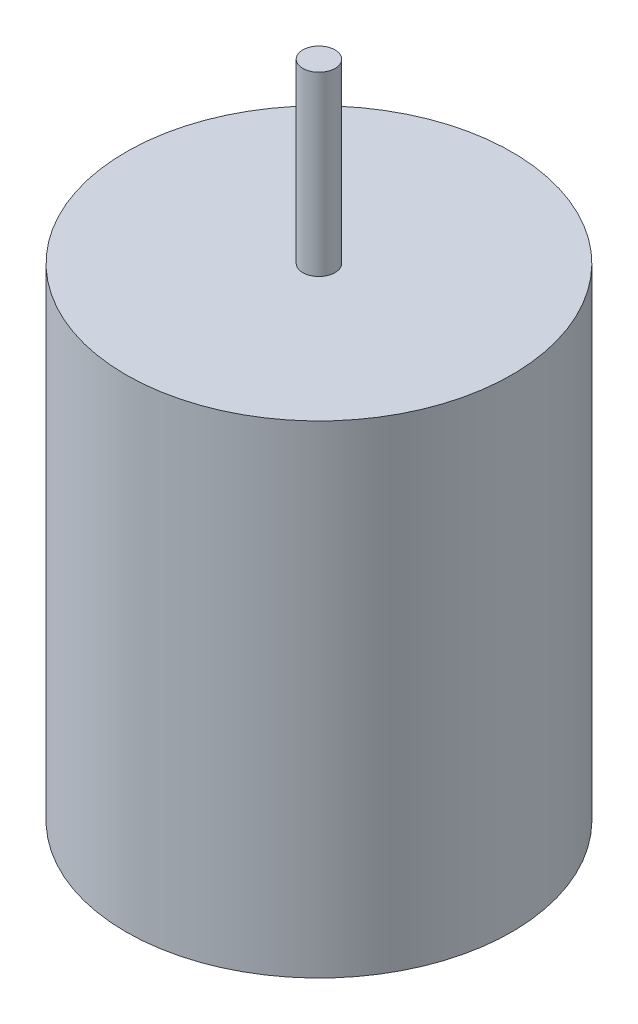
ISO-10303-21;
HEADER;
FILE_DESCRIPTION(('STEP AP214'),'2;1');
FILE_NAME('part.step','',(''),(''),'','','');
FILE_SCHEMA(('AUTOMOTIVE_DESIGN { 1 0 10303 214 1 1 1 1 }'));
ENDSEC;
DATA;
#1=APPLICATION_CONTEXT('core data for automotive mechanical design processes');
#2=APPLICATION_PROTOCOL_DEFINITION('international standard','automotive_design',2000,#1);
#3=PRODUCT_CONTEXT('',#1,'mechanical');
#4=PRODUCT('Part','Part','',(#3));
#5=PRODUCT_RELATED_PRODUCT_CATEGORY('part','',(#4));
#6=PRODUCT_DEFINITION_FORMATION('','',#4);
#7=PRODUCT_DEFINITION_CONTEXT('part definition',#1,'design');
#8=PRODUCT_DEFINITION('design','',#6,#7);
#9=PRODUCT_DEFINITION_SHAPE('','',#8);
#10=(LENGTH_UNIT() NAMED_UNIT(*) SI_UNIT(.MILLI.,.METRE.));
#11=(NAMED_UNIT(*) PLANE_ANGLE_UNIT() SI_UNIT($,.RADIAN.));
#12=(NAMED_UNIT(*) SI_UNIT($,.STERADIAN.) SOLID_ANGLE_UNIT());
#13=UNCERTAINTY_MEASURE_WITH_UNIT(LENGTH_MEASURE(1.E-05),#10,'distance_accuracy_value','');
#14=(GEOMETRIC_REPRESENTATION_CONTEXT(3) GLOBAL_UNCERTAINTY_ASSIGNED_CONTEXT((#13)) GLOBAL_UNIT_ASSIGNED_CONTEXT((#10,
#11,#12)) REPRESENTATION_CONTEXT('',''));
#15=CARTESIAN_POINT('',(0.,0.,0.));
#16=DIRECTION('',(0.,0.,1.));
#17=DIRECTION('',(1.,0.,0.));
#18=AXIS2_PLACEMENT_3D('',#15,#16,#17);
#19=CARTESIAN_POINT('',(0.,30.,0.));
#20=DIRECTION('',(0.,-1.,0.));
#21=DIRECTION('',(0.,0.,-1.));
#22=AXIS2_PLACEMENT_3D('',#19,#20,#21);
#23=CYLINDRICAL_SURFACE('',#22,12.);
#24=CARTESIAN_POINT('',(0.,30.,0.));
#25=DIRECTION('',(0.,1.,0.));
#26=DIRECTION('',(0.,0.,1.));
#27=AXIS2_PLACEMENT_3D('',#24,#25,#26);
#28=CIRCLE('',#27,12.);
#29=CARTESIAN_POINT('',(0.,30.,12.));
#30=VERTEX_POINT('',#29);
#31=EDGE_CURVE('E10',#30,#30,#28,.T.);
#32=ORIENTED_EDGE('',*,*,#31,.F.);
#33=EDGE_LOOP('',(#32));
#34=FACE_BOUND('',#33,.T.);
#35=CARTESIAN_POINT('',(0.,0.,0.));
#36=DIRECTION('',(0.,1.,0.));
#37=DIRECTION('',(0.,0.,1.));
#38=AXIS2_PLACEMENT_3D('',#35,#36,#37);
#39=CIRCLE('',#38,12.);
#40=CARTESIAN_POINT('',(0.,0.,12.));
#41=VERTEX_POINT('',#40);
#42=EDGE_CURVE('E46',#41,#41,#39,.T.);
#43=ORIENTED_EDGE('',*,*,#42,.T.);
#44=EDGE_LOOP('',(#43));
#45=FACE_BOUND('',#44,.T.);
#46=ADVANCED_FACE('F43',(#34,#45),#23,.T.);
#47=CARTESIAN_POINT('',(0.,30.,0.));
#48=DIRECTION('',(0.,1.,0.));
#49=DIRECTION('',(0.,0.,1.));
#50=AXIS2_PLACEMENT_3D('',#47,#48,#49);
#51=PLANE('',#50);
#52=CARTESIAN_POINT('',(0.,30.,0.));
#53=DIRECTION('',(0.,1.,0.));
#54=DIRECTION('',(0.,0.,1.));
#55=AXIS2_PLACEMENT_3D('',#52,#53,#54);
#56=CIRCLE('',#55,1.);
#57=CARTESIAN_POINT('',(0.,30.,1.));
#58=VERTEX_POINT('',#57);
#59=EDGE_CURVE('E55',#58,#58,#56,.T.);
#60=ORIENTED_EDGE('',*,*,#59,.F.);
#61=EDGE_LOOP('',(#60));
#62=FACE_BOUND('',#61,.T.);
#63=ORIENTED_EDGE('',*,*,#31,.T.);
#64=EDGE_LOOP('',(#63));
#65=FACE_BOUND('',#64,.T.);
#66=ADVANCED_FACE('F70',(#62,#65),#51,.T.);
#67=CARTESIAN_POINT('',(0.,0.,0.));
#68=DIRECTION('',(0.,1.,0.));
#69=DIRECTION('',(0.,0.,1.));
#70=AXIS2_PLACEMENT_3D('',#67,#68,#69);
#71=PLANE('',#70);
#72=ORIENTED_EDGE('',*,*,#42,.F.);
#73=EDGE_LOOP('',(#72));
#74=FACE_BOUND('',#73,.T.);
#75=ADVANCED_FACE('F66',(#74),#71,.F.);
#76=CARTESIAN_POINT('',(0.,41.,0.));
#77=DIRECTION('',(0.,-1.,0.));
#78=DIRECTION('',(0.,0.,-1.));
#79=AXIS2_PLACEMENT_3D('',#76,#77,#78);
#80=CYLINDRICAL_SURFACE('',#79,1.);
#81=CARTESIAN_POINT('',(0.,41.,0.));
#82=DIRECTION('',(0.,1.,0.));
#83=DIRECTION('',(0.,0.,1.));
#84=AXIS2_PLACEMENT_3D('',#81,#82,#83);
#85=CIRCLE('',#84,1.);
#86=CARTESIAN_POINT('',(0.,41.,1.));
#87=VERTEX_POINT('',#86);
#88=EDGE_CURVE('E53',#87,#87,#85,.T.);
#89=ORIENTED_EDGE('',*,*,#88,.F.);
#90=EDGE_LOOP('',(#89));
#91=FACE_BOUND('',#90,.T.);
#92=ORIENTED_EDGE('',*,*,#59,.T.);
#93=EDGE_LOOP('',(#92));
#94=FACE_BOUND('',#93,.T.);
#95=ADVANCED_FACE('F63',(#91,#94),#80,.T.);
#96=CARTESIAN_POINT('',(0.,41.,0.));
#97=DIRECTION('',(0.,1.,0.));
#98=DIRECTION('',(0.,0.,1.));
#99=AXIS2_PLACEMENT_3D('',#96,#97,#98);
#100=PLANE('',#99);
#101=ORIENTED_EDGE('',*,*,#88,.T.);
#102=EDGE_LOOP('',(#101));
#103=FACE_BOUND('',#102,.T.);
#104=ADVANCED_FACE('F61',(#103),#100,.T.);
#105=CLOSED_SHELL('',(#46,#66,#75,#95,#104));
#106=MANIFOLD_SOLID_BREP('B2',#105);
#107=ADVANCED_BREP_SHAPE_REPRESENTATION('',(#18,#106),#14);
#108=SHAPE_DEFINITION_REPRESENTATION(#9,#107);
ENDSEC;
END-ISO-10303-21;
